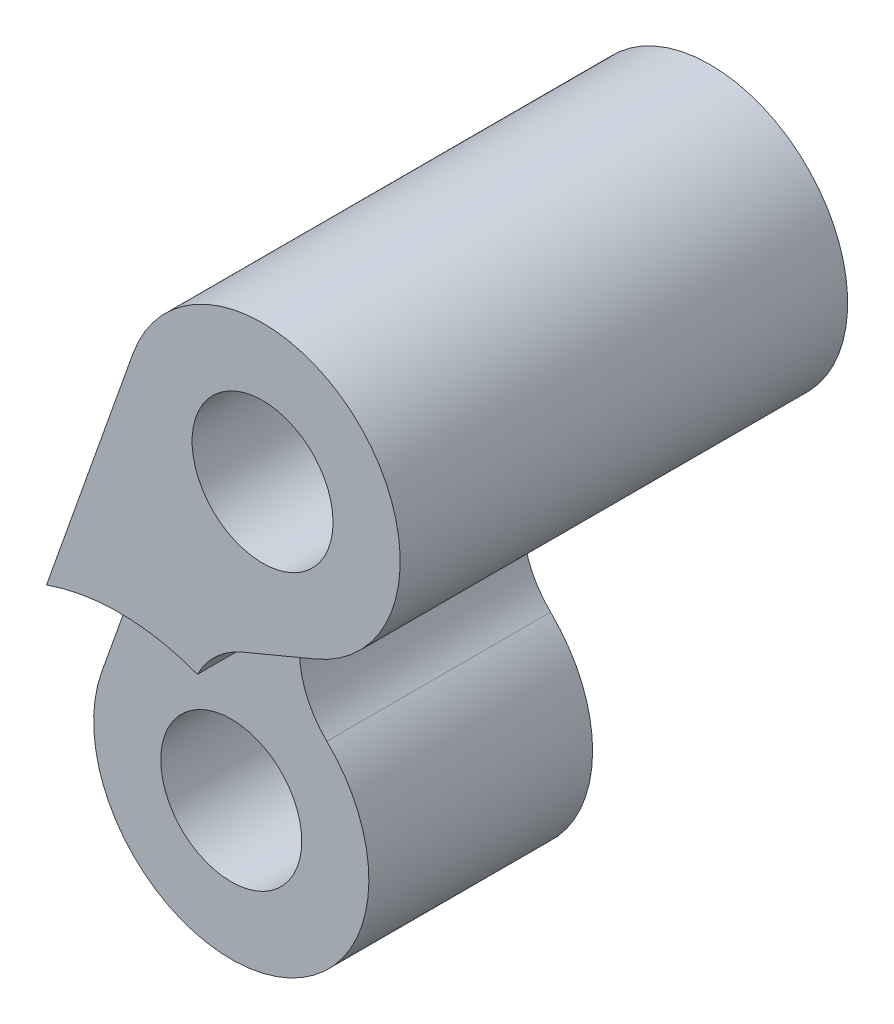
ISO-10303-21;
HEADER;
FILE_DESCRIPTION(('STEP AP214'),'2;1');
FILE_NAME('part.step','',(''),(''),'','','');
FILE_SCHEMA(('AUTOMOTIVE_DESIGN { 1 0 10303 214 1 1 1 1 }'));
ENDSEC;
DATA;
#1=APPLICATION_CONTEXT('core data for automotive mechanical design processes');
#2=APPLICATION_PROTOCOL_DEFINITION('international standard','automotive_design',2000,#1);
#3=PRODUCT_CONTEXT('',#1,'mechanical');
#4=PRODUCT('Part','Part','',(#3));
#5=PRODUCT_RELATED_PRODUCT_CATEGORY('part','',(#4));
#6=PRODUCT_DEFINITION_FORMATION('','',#4);
#7=PRODUCT_DEFINITION_CONTEXT('part definition',#1,'design');
#8=PRODUCT_DEFINITION('design','',#6,#7);
#9=PRODUCT_DEFINITION_SHAPE('','',#8);
#10=(LENGTH_UNIT() NAMED_UNIT(*) SI_UNIT(.MILLI.,.METRE.));
#11=(NAMED_UNIT(*) PLANE_ANGLE_UNIT() SI_UNIT($,.RADIAN.));
#12=(NAMED_UNIT(*) SI_UNIT($,.STERADIAN.) SOLID_ANGLE_UNIT());
#13=UNCERTAINTY_MEASURE_WITH_UNIT(LENGTH_MEASURE(1.E-05),#10,'distance_accuracy_value','');
#14=(GEOMETRIC_REPRESENTATION_CONTEXT(3) GLOBAL_UNCERTAINTY_ASSIGNED_CONTEXT((#13)) GLOBAL_UNIT_ASSIGNED_CONTEXT((#10,
#11,#12)) REPRESENTATION_CONTEXT('',''));
#15=CARTESIAN_POINT('',(0.,0.,0.));
#16=DIRECTION('',(0.,0.,1.));
#17=DIRECTION('',(1.,0.,0.));
#18=AXIS2_PLACEMENT_3D('',#15,#16,#17);
#19=CARTESIAN_POINT('',(-3.19979393636693,-9.01622354868428,5.));
#20=DIRECTION('',(0.,0.,-1.));
#21=DIRECTION('',(-1.,0.,0.));
#22=AXIS2_PLACEMENT_3D('',#19,#20,#21);
#23=CYLINDRICAL_SURFACE('',#22,3.075);
#24=DIRECTION('',(0.,0.,-1.));
#25=VECTOR('',#24,1.);
#26=CARTESIAN_POINT('',(-6.09770973671653,-7.98777373751985,5.));
#27=LINE('',#26,#25);
#28=CARTESIAN_POINT('',(-6.09770973671653,-7.98777373751985,2.5));
#29=VERTEX_POINT('',#28);
#30=CARTESIAN_POINT('',(-6.09770973671653,-7.98777373751985,-2.5));
#31=VERTEX_POINT('',#30);
#32=EDGE_CURVE('E169',#29,#31,#27,.T.);
#33=ORIENTED_EDGE('',*,*,#32,.T.);
#34=CARTESIAN_POINT('',(-3.19979393636693,-9.01622354868428,-2.5));
#35=DIRECTION('',(0.,0.,-1.));
#36=DIRECTION('',(-1.,0.,0.));
#37=AXIS2_PLACEMENT_3D('',#34,#35,#36);
#38=CIRCLE('',#37,3.075);
#39=CARTESIAN_POINT('',(-1.0641645474656,-6.80382392084555,-2.5));
#40=VERTEX_POINT('',#39);
#41=EDGE_CURVE('E117',#31,#40,#38,.F.);
#42=ORIENTED_EDGE('',*,*,#41,.T.);
#43=DIRECTION('',(0.,0.,-1.));
#44=VECTOR('',#43,1.);
#45=CARTESIAN_POINT('',(-1.0641645474656,-6.80382392084555,5.));
#46=LINE('',#45,#44);
#47=CARTESIAN_POINT('',(-1.0641645474656,-6.80382392084555,2.5));
#48=VERTEX_POINT('',#47);
#49=EDGE_CURVE('E129',#48,#40,#46,.T.);
#50=ORIENTED_EDGE('',*,*,#49,.F.);
#51=CARTESIAN_POINT('',(-3.19979393636693,-9.01622354868428,2.5));
#52=DIRECTION('',(0.,0.,1.));
#53=DIRECTION('',(1.,0.,0.));
#54=AXIS2_PLACEMENT_3D('',#51,#52,#53);
#55=CIRCLE('',#54,3.075);
#56=EDGE_CURVE('E145',#48,#29,#55,.F.);
#57=ORIENTED_EDGE('',*,*,#56,.T.);
#58=EDGE_LOOP('',(#33,#42,#50,#57));
#59=FACE_BOUND('',#58,.T.);
#60=ADVANCED_FACE('F39',(#59),#23,.T.);
#61=CARTESIAN_POINT('',(-3.19979393636693,-9.01622354868428,5.));
#62=DIRECTION('',(0.,0.,-1.));
#63=DIRECTION('',(-1.,0.,0.));
#64=AXIS2_PLACEMENT_3D('',#61,#62,#63);
#65=CYLINDRICAL_SURFACE('',#64,1.575);
#66=CARTESIAN_POINT('',(-3.19979393636693,-9.01622354868428,2.5));
#67=DIRECTION('',(0.,0.,1.));
#68=DIRECTION('',(1.,0.,0.));
#69=AXIS2_PLACEMENT_3D('',#66,#67,#68);
#70=CIRCLE('',#69,1.575);
#71=CARTESIAN_POINT('',(-1.62479393636693,-9.01622354868428,2.5));
#72=VERTEX_POINT('',#71);
#73=EDGE_CURVE('E150',#72,#72,#70,.T.);
#74=ORIENTED_EDGE('',*,*,#73,.T.);
#75=EDGE_LOOP('',(#74));
#76=FACE_BOUND('',#75,.T.);
#77=CARTESIAN_POINT('',(-3.19979393636693,-9.01622354868428,-2.5));
#78=DIRECTION('',(0.,0.,-1.));
#79=DIRECTION('',(-1.,0.,0.));
#80=AXIS2_PLACEMENT_3D('',#77,#78,#79);
#81=CIRCLE('',#80,1.575);
#82=CARTESIAN_POINT('',(-4.77479393636693,-9.01622354868428,-2.5));
#83=VERTEX_POINT('',#82);
#84=EDGE_CURVE('E130',#83,#83,#81,.T.);
#85=ORIENTED_EDGE('',*,*,#84,.T.);
#86=EDGE_LOOP('',(#85));
#87=FACE_BOUND('',#86,.T.);
#88=ADVANCED_FACE('F229',(#76,#87),#65,.F.);
#89=CARTESIAN_POINT('',(0.324862697348276,-5.36486481330817,5.));
#90=DIRECTION('',(0.,0.,-1.));
#91=DIRECTION('',(-1.,0.,0.));
#92=AXIS2_PLACEMENT_3D('',#89,#90,#91);
#93=CYLINDRICAL_SURFACE('',#92,2.);
#94=CARTESIAN_POINT('',(0.324862697348276,-5.36486481330817,-2.5));
#95=DIRECTION('',(0.,0.,-1.));
#96=DIRECTION('',(-1.,0.,0.));
#97=AXIS2_PLACEMENT_3D('',#94,#95,#96);
#98=CIRCLE('',#97,2.);
#99=CARTESIAN_POINT('',(-1.4555656854388,-4.45378041888238,-2.5));
#100=VERTEX_POINT('',#99);
#101=EDGE_CURVE('E121',#40,#100,#98,.T.);
#102=ORIENTED_EDGE('',*,*,#101,.T.);
#103=DIRECTION('',(0.,0.,-1.));
#104=VECTOR('',#103,1.);
#105=CARTESIAN_POINT('',(-1.4555656854388,-4.45378041888239,-3.75));
#106=LINE('',#105,#104);
#107=CARTESIAN_POINT('',(-1.4555656854388,-4.45378041888239,-5.));
#108=VERTEX_POINT('',#107);
#109=EDGE_CURVE('E108',#100,#108,#106,.T.);
#110=ORIENTED_EDGE('',*,*,#109,.T.);
#111=CARTESIAN_POINT('',(0.324862697348276,-5.36486481330817,-5.));
#112=DIRECTION('',(0.,0.,1.));
#113=DIRECTION('',(1.,0.,0.));
#114=AXIS2_PLACEMENT_3D('',#111,#112,#113);
#115=CIRCLE('',#114,2.);
#116=CARTESIAN_POINT('',(-0.446593534981376,-3.51963981846344,-5.));
#117=VERTEX_POINT('',#116);
#118=EDGE_CURVE('E153',#117,#108,#115,.T.);
#119=ORIENTED_EDGE('',*,*,#118,.F.);
#120=DIRECTION('',(0.,0.,-1.));
#121=VECTOR('',#120,1.);
#122=CARTESIAN_POINT('',(-0.446593534981376,-3.51963981846344,5.));
#123=LINE('',#122,#121);
#124=CARTESIAN_POINT('',(-0.446593534981376,-3.51963981846344,5.));
#125=VERTEX_POINT('',#124);
#126=EDGE_CURVE('E188',#125,#117,#123,.T.);
#127=ORIENTED_EDGE('',*,*,#126,.F.);
#128=CARTESIAN_POINT('',(0.324862697348276,-5.36486481330817,5.));
#129=DIRECTION('',(0.,0.,1.));
#130=DIRECTION('',(1.,0.,0.));
#131=AXIS2_PLACEMENT_3D('',#128,#129,#130);
#132=CIRCLE('',#131,2.);
#133=CARTESIAN_POINT('',(-1.4555656854388,-4.45378041888239,5.));
#134=VERTEX_POINT('',#133);
#135=EDGE_CURVE('E154',#125,#134,#132,.T.);
#136=ORIENTED_EDGE('',*,*,#135,.T.);
#137=DIRECTION('',(0.,0.,1.));
#138=VECTOR('',#137,1.);
#139=CARTESIAN_POINT('',(-1.4555656854388,-4.45378041888239,3.75));
#140=LINE('',#139,#138);
#141=CARTESIAN_POINT('',(-1.4555656854388,-4.45378041888238,2.5));
#142=VERTEX_POINT('',#141);
#143=EDGE_CURVE('E61',#142,#134,#140,.T.);
#144=ORIENTED_EDGE('',*,*,#143,.F.);
#145=CARTESIAN_POINT('',(0.324862697348276,-5.36486481330817,2.5));
#146=DIRECTION('',(0.,0.,1.));
#147=DIRECTION('',(1.,0.,0.));
#148=AXIS2_PLACEMENT_3D('',#145,#146,#147);
#149=CIRCLE('',#148,2.);
#150=EDGE_CURVE('E148',#142,#48,#149,.T.);
#151=ORIENTED_EDGE('',*,*,#150,.T.);
#152=ORIENTED_EDGE('',*,*,#49,.T.);
#153=EDGE_LOOP('',(#102,#110,#119,#127,#136,#144,#151,#152));
#154=FACE_BOUND('',#153,.T.);
#155=ADVANCED_FACE('F126',(#154),#93,.F.);
#156=CARTESIAN_POINT('',(-2.8979158003496,1.02844981116442,5.));
#157=DIRECTION('',(0.942411642390114,-0.334455223142902,0.));
#158=DIRECTION('',(0.334455223142902,0.942411642390114,0.));
#159=AXIS2_PLACEMENT_3D('',#156,#157,#158);
#160=PLANE('',#159);
#161=DIRECTION('',(0.,0.,-1.));
#162=VECTOR('',#161,1.);
#163=CARTESIAN_POINT('',(-4.82842706980245,-4.41125084293582,-2.5));
#164=LINE('',#163,#162);
#165=CARTESIAN_POINT('',(-4.82842706980245,-4.41125084293582,-2.5));
#166=VERTEX_POINT('',#165);
#167=CARTESIAN_POINT('',(-4.82842706980245,-4.41125084293582,-5.));
#168=VERTEX_POINT('',#167);
#169=EDGE_CURVE('E53',#166,#168,#164,.T.);
#170=ORIENTED_EDGE('',*,*,#169,.F.);
#171=DIRECTION('',(0.334455223142902,0.942411642390114,0.));
#172=VECTOR('',#171,1.);
#173=CARTESIAN_POINT('',(-2.8979158003496,1.02844981116442,-2.5));
#174=LINE('',#173,#172);
#175=EDGE_CURVE('E11',#31,#166,#174,.T.);
#176=ORIENTED_EDGE('',*,*,#175,.F.);
#177=ORIENTED_EDGE('',*,*,#32,.F.);
#178=DIRECTION('',(-0.334455223142902,-0.942411642390114,0.));
#179=VECTOR('',#178,1.);
#180=CARTESIAN_POINT('',(-2.8979158003496,1.02844981116442,2.5));
#181=LINE('',#180,#179);
#182=CARTESIAN_POINT('',(-4.82842706980245,-4.41125084293582,2.5));
#183=VERTEX_POINT('',#182);
#184=EDGE_CURVE('E46',#183,#29,#181,.T.);
#185=ORIENTED_EDGE('',*,*,#184,.F.);
#186=DIRECTION('',(0.,0.,1.));
#187=VECTOR('',#186,1.);
#188=CARTESIAN_POINT('',(-4.82842706980245,-4.41125084293582,2.5));
#189=LINE('',#188,#187);
#190=CARTESIAN_POINT('',(-4.82842706980245,-4.41125084293582,5.));
#191=VERTEX_POINT('',#190);
#192=EDGE_CURVE('E140',#183,#191,#189,.T.);
#193=ORIENTED_EDGE('',*,*,#192,.T.);
#194=DIRECTION('',(-0.334455223142902,-0.942411642390114,0.));
#195=VECTOR('',#194,1.);
#196=CARTESIAN_POINT('',(-2.8979158003496,1.02844981116442,5.));
#197=LINE('',#196,#195);
#198=CARTESIAN_POINT('',(-2.8979158003496,1.02844981116442,5.));
#199=VERTEX_POINT('',#198);
#200=EDGE_CURVE('E163',#199,#191,#197,.T.);
#201=ORIENTED_EDGE('',*,*,#200,.F.);
#202=DIRECTION('',(0.,0.,-1.));
#203=VECTOR('',#202,1.);
#204=CARTESIAN_POINT('',(-2.8979158003496,1.02844981116442,5.));
#205=LINE('',#204,#203);
#206=CARTESIAN_POINT('',(-2.8979158003496,1.02844981116442,-5.));
#207=VERTEX_POINT('',#206);
#208=EDGE_CURVE('E183',#199,#207,#205,.T.);
#209=ORIENTED_EDGE('',*,*,#208,.T.);
#210=DIRECTION('',(-0.334455223142902,-0.942411642390114,0.));
#211=VECTOR('',#210,1.);
#212=CARTESIAN_POINT('',(-2.8979158003496,1.02844981116442,-5.));
#213=LINE('',#212,#211);
#214=EDGE_CURVE('E176',#207,#168,#213,.T.);
#215=ORIENTED_EDGE('',*,*,#214,.T.);
#216=EDGE_LOOP('',(#170,#176,#177,#185,#193,#201,#209,#215));
#217=FACE_BOUND('',#216,.T.);
#218=ADVANCED_FACE('F196',(#217),#160,.F.);
#219=CARTESIAN_POINT('',(1.18611395720684,-2.83703342957377,5.));
#220=DIRECTION('',(0.385728116164826,-0.922612497422366,0.));
#221=DIRECTION('',(0.922612497422365,0.385728116164826,0.));
#222=AXIS2_PLACEMENT_3D('',#219,#220,#221);
#223=PLANE('',#222);
#224=DIRECTION('',(-0.922612497422366,-0.385728116164826,0.));
#225=VECTOR('',#224,1.);
#226=CARTESIAN_POINT('',(1.18611395720684,-2.83703342957377,-5.));
#227=LINE('',#226,#225);
#228=CARTESIAN_POINT('',(1.18611395720684,-2.83703342957377,-5.));
#229=VERTEX_POINT('',#228);
#230=EDGE_CURVE('E171',#229,#117,#227,.T.);
#231=ORIENTED_EDGE('',*,*,#230,.F.);
#232=DIRECTION('',(0.,0.,-1.));
#233=VECTOR('',#232,1.);
#234=CARTESIAN_POINT('',(1.18611395720684,-2.83703342957377,5.));
#235=LINE('',#234,#233);
#236=CARTESIAN_POINT('',(1.18611395720684,-2.83703342957377,5.));
#237=VERTEX_POINT('',#236);
#238=EDGE_CURVE('E186',#237,#229,#235,.T.);
#239=ORIENTED_EDGE('',*,*,#238,.F.);
#240=DIRECTION('',(-0.922612497422366,-0.385728116164826,0.));
#241=VECTOR('',#240,1.);
#242=CARTESIAN_POINT('',(1.18611395720684,-2.83703342957377,5.));
#243=LINE('',#242,#241);
#244=EDGE_CURVE('E157',#237,#125,#243,.T.);
#245=ORIENTED_EDGE('',*,*,#244,.T.);
#246=ORIENTED_EDGE('',*,*,#126,.T.);
#247=EDGE_LOOP('',(#231,#239,#245,#246));
#248=FACE_BOUND('',#247,.T.);
#249=ADVANCED_FACE('F211',(#248),#223,.T.);
#250=CARTESIAN_POINT('',(0.,0.,5.));
#251=DIRECTION('',(0.,0.,-1.));
#252=DIRECTION('',(-1.,0.,0.));
#253=AXIS2_PLACEMENT_3D('',#250,#251,#252);
#254=CYLINDRICAL_SURFACE('',#253,3.075);
#255=CARTESIAN_POINT('',(0.,0.,-5.));
#256=DIRECTION('',(0.,0.,1.));
#257=DIRECTION('',(1.,0.,0.));
#258=AXIS2_PLACEMENT_3D('',#255,#256,#257);
#259=CIRCLE('',#258,3.075);
#260=EDGE_CURVE('E174',#229,#207,#259,.T.);
#261=ORIENTED_EDGE('',*,*,#260,.T.);
#262=ORIENTED_EDGE('',*,*,#208,.F.);
#263=CARTESIAN_POINT('',(0.,0.,5.));
#264=DIRECTION('',(0.,0.,1.));
#265=DIRECTION('',(1.,0.,0.));
#266=AXIS2_PLACEMENT_3D('',#263,#264,#265);
#267=CIRCLE('',#266,3.075);
#268=EDGE_CURVE('E161',#237,#199,#267,.T.);
#269=ORIENTED_EDGE('',*,*,#268,.F.);
#270=ORIENTED_EDGE('',*,*,#238,.T.);
#271=EDGE_LOOP('',(#261,#262,#269,#270));
#272=FACE_BOUND('',#271,.T.);
#273=ADVANCED_FACE('F215',(#272),#254,.T.);
#274=CARTESIAN_POINT('',(0.,0.,5.));
#275=DIRECTION('',(0.,0.,-1.));
#276=DIRECTION('',(-1.,0.,0.));
#277=AXIS2_PLACEMENT_3D('',#274,#275,#276);
#278=CYLINDRICAL_SURFACE('',#277,1.575);
#279=CARTESIAN_POINT('',(0.,0.,5.));
#280=DIRECTION('',(0.,0.,1.));
#281=DIRECTION('',(1.,0.,0.));
#282=AXIS2_PLACEMENT_3D('',#279,#280,#281);
#283=CIRCLE('',#282,1.575);
#284=CARTESIAN_POINT('',(1.575,0.,5.));
#285=VERTEX_POINT('',#284);
#286=EDGE_CURVE('E166',#285,#285,#283,.T.);
#287=ORIENTED_EDGE('',*,*,#286,.T.);
#288=EDGE_LOOP('',(#287));
#289=FACE_BOUND('',#288,.T.);
#290=CARTESIAN_POINT('',(0.,0.,-5.));
#291=DIRECTION('',(0.,0.,1.));
#292=DIRECTION('',(1.,0.,0.));
#293=AXIS2_PLACEMENT_3D('',#290,#291,#292);
#294=CIRCLE('',#293,1.575);
#295=CARTESIAN_POINT('',(1.575,0.,-5.));
#296=VERTEX_POINT('',#295);
#297=EDGE_CURVE('E158',#296,#296,#294,.T.);
#298=ORIENTED_EDGE('',*,*,#297,.F.);
#299=EDGE_LOOP('',(#298));
#300=FACE_BOUND('',#299,.T.);
#301=ADVANCED_FACE('F241',(#289,#300),#278,.F.);
#302=CARTESIAN_POINT('',(0.,0.,5.));
#303=DIRECTION('',(0.,0.,1.));
#304=DIRECTION('',(1.,0.,0.));
#305=AXIS2_PLACEMENT_3D('',#302,#303,#304);
#306=PLANE('',#305);
#307=CARTESIAN_POINT('',(-3.19979393636693,-9.01622354868428,5.));
#308=DIRECTION('',(0.,0.,1.));
#309=DIRECTION('',(1.,0.,0.));
#310=AXIS2_PLACEMENT_3D('',#307,#308,#309);
#311=CIRCLE('',#310,4.88448763986688);
#312=EDGE_CURVE('E133',#134,#191,#311,.T.);
#313=ORIENTED_EDGE('',*,*,#312,.F.);
#314=ORIENTED_EDGE('',*,*,#135,.F.);
#315=ORIENTED_EDGE('',*,*,#244,.F.);
#316=ORIENTED_EDGE('',*,*,#268,.T.);
#317=ORIENTED_EDGE('',*,*,#200,.T.);
#318=EDGE_LOOP('',(#313,#314,#315,#316,#317));
#319=FACE_BOUND('',#318,.T.);
#320=ORIENTED_EDGE('',*,*,#286,.F.);
#321=EDGE_LOOP('',(#320));
#322=FACE_BOUND('',#321,.T.);
#323=ADVANCED_FACE('F209',(#319,#322),#306,.T.);
#324=CARTESIAN_POINT('',(0.,0.,-5.));
#325=DIRECTION('',(0.,0.,1.));
#326=DIRECTION('',(1.,0.,0.));
#327=AXIS2_PLACEMENT_3D('',#324,#325,#326);
#328=PLANE('',#327);
#329=CARTESIAN_POINT('',(-3.19979393636693,-9.01622354868428,-5.));
#330=DIRECTION('',(0.,0.,1.));
#331=DIRECTION('',(1.,0.,0.));
#332=AXIS2_PLACEMENT_3D('',#329,#330,#331);
#333=CIRCLE('',#332,4.88448763986688);
#334=EDGE_CURVE('E112',#108,#168,#333,.T.);
#335=ORIENTED_EDGE('',*,*,#334,.T.);
#336=ORIENTED_EDGE('',*,*,#214,.F.);
#337=ORIENTED_EDGE('',*,*,#260,.F.);
#338=ORIENTED_EDGE('',*,*,#230,.T.);
#339=ORIENTED_EDGE('',*,*,#118,.T.);
#340=EDGE_LOOP('',(#335,#336,#337,#338,#339));
#341=FACE_BOUND('',#340,.T.);
#342=ORIENTED_EDGE('',*,*,#297,.T.);
#343=EDGE_LOOP('',(#342));
#344=FACE_BOUND('',#343,.T.);
#345=ADVANCED_FACE('F201',(#341,#344),#328,.F.);
#346=CARTESIAN_POINT('',(-3.19979393636693,-9.01622354868428,2.5));
#347=DIRECTION('',(0.,0.,1.));
#348=DIRECTION('',(1.,0.,0.));
#349=AXIS2_PLACEMENT_3D('',#346,#347,#348);
#350=CYLINDRICAL_SURFACE('',#349,4.88448763986688);
#351=ORIENTED_EDGE('',*,*,#143,.T.);
#352=ORIENTED_EDGE('',*,*,#312,.T.);
#353=ORIENTED_EDGE('',*,*,#192,.F.);
#354=CARTESIAN_POINT('',(-3.19979393636693,-9.01622354868428,2.5));
#355=DIRECTION('',(0.,0.,1.));
#356=DIRECTION('',(1.,0.,0.));
#357=AXIS2_PLACEMENT_3D('',#354,#355,#356);
#358=CIRCLE('',#357,4.88448763986688);
#359=EDGE_CURVE('E137',#142,#183,#358,.T.);
#360=ORIENTED_EDGE('',*,*,#359,.F.);
#361=EDGE_LOOP('',(#351,#352,#353,#360));
#362=FACE_BOUND('',#361,.T.);
#363=ADVANCED_FACE('F217',(#362),#350,.F.);
#364=CARTESIAN_POINT('',(-3.19979393636693,-9.01622354868428,2.5));
#365=DIRECTION('',(0.,0.,1.));
#366=DIRECTION('',(1.,0.,0.));
#367=AXIS2_PLACEMENT_3D('',#364,#365,#366);
#368=PLANE('',#367);
#369=ORIENTED_EDGE('',*,*,#73,.F.);
#370=EDGE_LOOP('',(#369));
#371=FACE_BOUND('',#370,.T.);
#372=ORIENTED_EDGE('',*,*,#359,.T.);
#373=ORIENTED_EDGE('',*,*,#184,.T.);
#374=ORIENTED_EDGE('',*,*,#56,.F.);
#375=ORIENTED_EDGE('',*,*,#150,.F.);
#376=EDGE_LOOP('',(#372,#373,#374,#375));
#377=FACE_BOUND('',#376,.T.);
#378=ADVANCED_FACE('F192',(#371,#377),#368,.T.);
#379=CARTESIAN_POINT('',(-3.19979393636693,-9.01622354868428,-2.5));
#380=DIRECTION('',(0.,0.,-1.));
#381=DIRECTION('',(-1.,0.,0.));
#382=AXIS2_PLACEMENT_3D('',#379,#380,#381);
#383=CYLINDRICAL_SURFACE('',#382,4.88448763986688);
#384=CARTESIAN_POINT('',(-3.19979393636693,-9.01622354868428,-2.5));
#385=DIRECTION('',(0.,0.,1.));
#386=DIRECTION('',(1.,0.,0.));
#387=AXIS2_PLACEMENT_3D('',#384,#385,#386);
#388=CIRCLE('',#387,4.88448763986688);
#389=EDGE_CURVE('E111',#100,#166,#388,.T.);
#390=ORIENTED_EDGE('',*,*,#389,.T.);
#391=ORIENTED_EDGE('',*,*,#169,.T.);
#392=ORIENTED_EDGE('',*,*,#334,.F.);
#393=ORIENTED_EDGE('',*,*,#109,.F.);
#394=EDGE_LOOP('',(#390,#391,#392,#393));
#395=FACE_BOUND('',#394,.T.);
#396=ADVANCED_FACE('F110',(#395),#383,.F.);
#397=CARTESIAN_POINT('',(-3.19979393636693,-9.01622354868428,-2.5));
#398=DIRECTION('',(0.,0.,-1.));
#399=DIRECTION('',(1.,0.,0.));
#400=AXIS2_PLACEMENT_3D('',#397,#398,#399);
#401=PLANE('',#400);
#402=ORIENTED_EDGE('',*,*,#84,.F.);
#403=EDGE_LOOP('',(#402));
#404=FACE_BOUND('',#403,.T.);
#405=ORIENTED_EDGE('',*,*,#41,.F.);
#406=ORIENTED_EDGE('',*,*,#175,.T.);
#407=ORIENTED_EDGE('',*,*,#389,.F.);
#408=ORIENTED_EDGE('',*,*,#101,.F.);
#409=EDGE_LOOP('',(#405,#406,#407,#408));
#410=FACE_BOUND('',#409,.T.);
#411=ADVANCED_FACE('F120',(#404,#410),#401,.T.);
#412=CLOSED_SHELL('',(#60,#88,#155,#218,#249,#273,#301,#323,#345,#363,#378,#396,#411));
#413=MANIFOLD_SOLID_BREP('B2',#412);
#414=ADVANCED_BREP_SHAPE_REPRESENTATION('',(#18,#413),#14);
#415=SHAPE_DEFINITION_REPRESENTATION(#9,#414);
ENDSEC;
END-ISO-10303-21;
